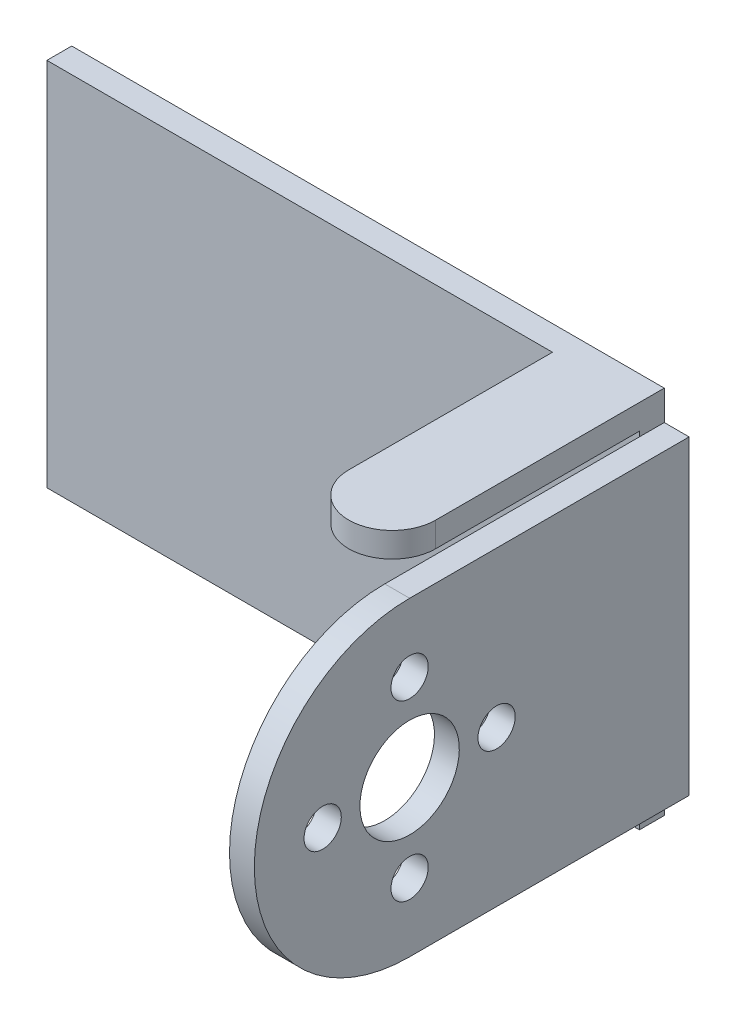
ISO-10303-21;
HEADER;
FILE_DESCRIPTION(('STEP AP214'),'2;1');
FILE_NAME('part.step','',(''),(''),'','','');
FILE_SCHEMA(('AUTOMOTIVE_DESIGN { 1 0 10303 214 1 1 1 1 }'));
ENDSEC;
DATA;
#1=APPLICATION_CONTEXT('core data for automotive mechanical design processes');
#2=APPLICATION_PROTOCOL_DEFINITION('international standard','automotive_design',2000,#1);
#3=PRODUCT_CONTEXT('',#1,'mechanical');
#4=PRODUCT('Part','Part','',(#3));
#5=PRODUCT_RELATED_PRODUCT_CATEGORY('part','',(#4));
#6=PRODUCT_DEFINITION_FORMATION('','',#4);
#7=PRODUCT_DEFINITION_CONTEXT('part definition',#1,'design');
#8=PRODUCT_DEFINITION('design','',#6,#7);
#9=PRODUCT_DEFINITION_SHAPE('','',#8);
#10=(LENGTH_UNIT() NAMED_UNIT(*) SI_UNIT(.MILLI.,.METRE.));
#11=(NAMED_UNIT(*) PLANE_ANGLE_UNIT() SI_UNIT($,.RADIAN.));
#12=(NAMED_UNIT(*) SI_UNIT($,.STERADIAN.) SOLID_ANGLE_UNIT());
#13=UNCERTAINTY_MEASURE_WITH_UNIT(LENGTH_MEASURE(1.E-05),#10,'distance_accuracy_value','');
#14=(GEOMETRIC_REPRESENTATION_CONTEXT(3) GLOBAL_UNCERTAINTY_ASSIGNED_CONTEXT((#13)) GLOBAL_UNIT_ASSIGNED_CONTEXT((#10,
#11,#12)) REPRESENTATION_CONTEXT('',''));
#15=CARTESIAN_POINT('',(0.,0.,0.));
#16=DIRECTION('',(0.,0.,1.));
#17=DIRECTION('',(1.,0.,0.));
#18=AXIS2_PLACEMENT_3D('',#15,#16,#17);
#19=CARTESIAN_POINT('',(23.85,14.9,2.));
#20=DIRECTION('',(-1.,0.,0.));
#21=DIRECTION('',(0.,-1.,0.));
#22=AXIS2_PLACEMENT_3D('',#19,#20,#21);
#23=PLANE('',#22);
#24=DIRECTION('',(0.,0.,1.));
#25=VECTOR('',#24,1.);
#26=CARTESIAN_POINT('',(23.85,12.5,0.));
#27=LINE('',#26,#25);
#28=CARTESIAN_POINT('',(23.85,12.5,0.));
#29=VERTEX_POINT('',#28);
#30=CARTESIAN_POINT('',(23.85,12.5,2.));
#31=VERTEX_POINT('',#30);
#32=EDGE_CURVE('E299',#29,#31,#27,.T.);
#33=ORIENTED_EDGE('',*,*,#32,.F.);
#34=DIRECTION('',(0.,1.,0.));
#35=VECTOR('',#34,1.);
#36=CARTESIAN_POINT('',(23.85,14.9,0.));
#37=LINE('',#36,#35);
#38=CARTESIAN_POINT('',(23.85,14.9,0.));
#39=VERTEX_POINT('',#38);
#40=EDGE_CURVE('E220',#29,#39,#37,.T.);
#41=ORIENTED_EDGE('',*,*,#40,.T.);
#42=DIRECTION('',(0.,0.,-1.));
#43=VECTOR('',#42,1.);
#44=CARTESIAN_POINT('',(23.85,14.9,2.));
#45=LINE('',#44,#43);
#46=CARTESIAN_POINT('',(23.85,14.9,18.4));
#47=VERTEX_POINT('',#46);
#48=EDGE_CURVE('E12',#47,#39,#45,.T.);
#49=ORIENTED_EDGE('',*,*,#48,.F.);
#50=DIRECTION('',(0.,-1.,0.));
#51=VECTOR('',#50,1.);
#52=CARTESIAN_POINT('',(23.85,14.9,18.4));
#53=LINE('',#52,#51);
#54=CARTESIAN_POINT('',(23.85,12.9,18.4));
#55=VERTEX_POINT('',#54);
#56=EDGE_CURVE('E184',#47,#55,#53,.T.);
#57=ORIENTED_EDGE('',*,*,#56,.T.);
#58=DIRECTION('',(0.,0.,-1.));
#59=VECTOR('',#58,1.);
#60=CARTESIAN_POINT('',(23.85,12.9,21.9));
#61=LINE('',#60,#59);
#62=CARTESIAN_POINT('',(23.85,12.9,2.));
#63=VERTEX_POINT('',#62);
#64=EDGE_CURVE('E211',#55,#63,#61,.T.);
#65=ORIENTED_EDGE('',*,*,#64,.T.);
#66=DIRECTION('',(0.,1.,0.));
#67=VECTOR('',#66,1.);
#68=CARTESIAN_POINT('',(23.85,14.9,2.));
#69=LINE('',#68,#67);
#70=EDGE_CURVE('E74',#31,#63,#69,.T.);
#71=ORIENTED_EDGE('',*,*,#70,.F.);
#72=EDGE_LOOP('',(#33,#41,#49,#57,#65,#71));
#73=FACE_BOUND('',#72,.T.);
#74=ADVANCED_FACE('F59',(#73),#23,.F.);
#75=DIRECTION('',(0.,0.,-1.));
#76=VECTOR('',#75,1.);
#77=CARTESIAN_POINT('',(23.85,-12.5,0.));
#78=LINE('',#77,#76);
#79=CARTESIAN_POINT('',(23.85,-12.5,2.));
#80=VERTEX_POINT('',#79);
#81=CARTESIAN_POINT('',(23.85,-12.5,0.));
#82=VERTEX_POINT('',#81);
#83=EDGE_CURVE('E82',#80,#82,#78,.T.);
#84=ORIENTED_EDGE('',*,*,#83,.F.);
#85=CARTESIAN_POINT('',(23.85,-14.9,2.));
#86=VERTEX_POINT('',#85);
#87=EDGE_CURVE('E221',#86,#80,#69,.T.);
#88=ORIENTED_EDGE('',*,*,#87,.F.);
#89=DIRECTION('',(0.,0.,-1.));
#90=VECTOR('',#89,1.);
#91=CARTESIAN_POINT('',(23.85,-14.9,2.));
#92=LINE('',#91,#90);
#93=CARTESIAN_POINT('',(23.85,-14.9,0.));
#94=VERTEX_POINT('',#93);
#95=EDGE_CURVE('E233',#86,#94,#92,.T.);
#96=ORIENTED_EDGE('',*,*,#95,.T.);
#97=EDGE_CURVE('E234',#94,#82,#37,.T.);
#98=ORIENTED_EDGE('',*,*,#97,.T.);
#99=EDGE_LOOP('',(#84,#88,#96,#98));
#100=FACE_BOUND('',#99,.T.);
#101=ADVANCED_FACE('F272',(#100),#23,.F.);
#102=CARTESIAN_POINT('',(-23.85,14.9,2.));
#103=DIRECTION('',(0.,-1.,0.));
#104=DIRECTION('',(0.,0.,-1.));
#105=AXIS2_PLACEMENT_3D('',#102,#103,#104);
#106=PLANE('',#105);
#107=CARTESIAN_POINT('',(20.35,14.9,18.4));
#108=DIRECTION('',(0.,-1.,0.));
#109=DIRECTION('',(0.,0.,-1.));
#110=AXIS2_PLACEMENT_3D('',#107,#108,#109);
#111=CIRCLE('',#110,3.5);
#112=CARTESIAN_POINT('',(16.85,14.9,18.4));
#113=VERTEX_POINT('',#112);
#114=EDGE_CURVE('E194',#47,#113,#111,.T.);
#115=ORIENTED_EDGE('',*,*,#114,.F.);
#116=ORIENTED_EDGE('',*,*,#48,.T.);
#117=DIRECTION('',(-1.,0.,0.));
#118=VECTOR('',#117,1.);
#119=CARTESIAN_POINT('',(-23.85,14.9,0.));
#120=LINE('',#119,#118);
#121=CARTESIAN_POINT('',(-23.85,14.9,0.));
#122=VERTEX_POINT('',#121);
#123=EDGE_CURVE('E237',#39,#122,#120,.T.);
#124=ORIENTED_EDGE('',*,*,#123,.T.);
#125=DIRECTION('',(0.,0.,-1.));
#126=VECTOR('',#125,1.);
#127=CARTESIAN_POINT('',(-23.85,14.9,2.));
#128=LINE('',#127,#126);
#129=CARTESIAN_POINT('',(-23.85,14.9,2.));
#130=VERTEX_POINT('',#129);
#131=EDGE_CURVE('E67',#130,#122,#128,.T.);
#132=ORIENTED_EDGE('',*,*,#131,.F.);
#133=DIRECTION('',(-1.,0.,0.));
#134=VECTOR('',#133,1.);
#135=CARTESIAN_POINT('',(-23.85,14.9,2.));
#136=LINE('',#135,#134);
#137=CARTESIAN_POINT('',(16.85,14.9,2.));
#138=VERTEX_POINT('',#137);
#139=EDGE_CURVE('E224',#138,#130,#136,.T.);
#140=ORIENTED_EDGE('',*,*,#139,.F.);
#141=DIRECTION('',(0.,0.,-1.));
#142=VECTOR('',#141,1.);
#143=CARTESIAN_POINT('',(16.85,14.9,21.9));
#144=LINE('',#143,#142);
#145=EDGE_CURVE('E217',#113,#138,#144,.T.);
#146=ORIENTED_EDGE('',*,*,#145,.F.);
#147=EDGE_LOOP('',(#115,#116,#124,#132,#140,#146));
#148=FACE_BOUND('',#147,.T.);
#149=ADVANCED_FACE('F368',(#148),#106,.F.);
#150=CARTESIAN_POINT('',(16.85,12.9,21.9));
#151=DIRECTION('',(0.,1.,0.));
#152=DIRECTION('',(0.,0.,1.));
#153=AXIS2_PLACEMENT_3D('',#150,#151,#152);
#154=PLANE('',#153);
#155=ORIENTED_EDGE('',*,*,#64,.F.);
#156=CARTESIAN_POINT('',(20.35,12.9,18.4));
#157=DIRECTION('',(0.,-1.,0.));
#158=DIRECTION('',(0.,0.,-1.));
#159=AXIS2_PLACEMENT_3D('',#156,#157,#158);
#160=CIRCLE('',#159,3.5);
#161=CARTESIAN_POINT('',(16.85,12.9,18.4));
#162=VERTEX_POINT('',#161);
#163=EDGE_CURVE('E193',#55,#162,#160,.T.);
#164=ORIENTED_EDGE('',*,*,#163,.T.);
#165=DIRECTION('',(0.,0.,-1.));
#166=VECTOR('',#165,1.);
#167=CARTESIAN_POINT('',(16.85,12.9,21.9));
#168=LINE('',#167,#166);
#169=CARTESIAN_POINT('',(16.85,12.9,2.));
#170=VERTEX_POINT('',#169);
#171=EDGE_CURVE('E214',#162,#170,#168,.T.);
#172=ORIENTED_EDGE('',*,*,#171,.T.);
#173=DIRECTION('',(1.,0.,0.));
#174=VECTOR('',#173,1.);
#175=CARTESIAN_POINT('',(16.85,12.9,2.));
#176=LINE('',#175,#174);
#177=EDGE_CURVE('E207',#170,#63,#176,.T.);
#178=ORIENTED_EDGE('',*,*,#177,.T.);
#179=EDGE_LOOP('',(#155,#164,#172,#178));
#180=FACE_BOUND('',#179,.T.);
#181=ADVANCED_FACE('F376',(#180),#154,.F.);
#182=CARTESIAN_POINT('',(16.85,14.9,21.9));
#183=DIRECTION('',(1.,0.,0.));
#184=DIRECTION('',(0.,0.,-1.));
#185=AXIS2_PLACEMENT_3D('',#182,#183,#184);
#186=PLANE('',#185);
#187=DIRECTION('',(0.,-1.,0.));
#188=VECTOR('',#187,1.);
#189=CARTESIAN_POINT('',(16.85,14.9,18.4));
#190=LINE('',#189,#188);
#191=EDGE_CURVE('E197',#113,#162,#190,.T.);
#192=ORIENTED_EDGE('',*,*,#191,.F.);
#193=ORIENTED_EDGE('',*,*,#145,.T.);
#194=DIRECTION('',(0.,-1.,0.));
#195=VECTOR('',#194,1.);
#196=CARTESIAN_POINT('',(16.85,14.9,2.));
#197=LINE('',#196,#195);
#198=EDGE_CURVE('E203',#138,#170,#197,.T.);
#199=ORIENTED_EDGE('',*,*,#198,.T.);
#200=ORIENTED_EDGE('',*,*,#171,.F.);
#201=EDGE_LOOP('',(#192,#193,#199,#200));
#202=FACE_BOUND('',#201,.T.);
#203=ADVANCED_FACE('F380',(#202),#186,.F.);
#204=CARTESIAN_POINT('',(-23.85,14.9,2.));
#205=DIRECTION('',(1.,0.,0.));
#206=DIRECTION('',(0.,1.,0.));
#207=AXIS2_PLACEMENT_3D('',#204,#205,#206);
#208=PLANE('',#207);
#209=DIRECTION('',(0.,-1.,0.));
#210=VECTOR('',#209,1.);
#211=CARTESIAN_POINT('',(-23.85,14.9,0.));
#212=LINE('',#211,#210);
#213=CARTESIAN_POINT('',(-23.85,-14.9,0.));
#214=VERTEX_POINT('',#213);
#215=EDGE_CURVE('E240',#122,#214,#212,.T.);
#216=ORIENTED_EDGE('',*,*,#215,.T.);
#217=DIRECTION('',(0.,0.,-1.));
#218=VECTOR('',#217,1.);
#219=CARTESIAN_POINT('',(-23.85,-14.9,2.));
#220=LINE('',#219,#218);
#221=CARTESIAN_POINT('',(-23.85,-14.9,2.));
#222=VERTEX_POINT('',#221);
#223=EDGE_CURVE('E249',#222,#214,#220,.T.);
#224=ORIENTED_EDGE('',*,*,#223,.F.);
#225=DIRECTION('',(0.,-1.,0.));
#226=VECTOR('',#225,1.);
#227=CARTESIAN_POINT('',(-23.85,14.9,2.));
#228=LINE('',#227,#226);
#229=EDGE_CURVE('E227',#130,#222,#228,.T.);
#230=ORIENTED_EDGE('',*,*,#229,.F.);
#231=ORIENTED_EDGE('',*,*,#131,.T.);
#232=EDGE_LOOP('',(#216,#224,#230,#231));
#233=FACE_BOUND('',#232,.T.);
#234=ADVANCED_FACE('F258',(#233),#208,.F.);
#235=CARTESIAN_POINT('',(-23.85,-14.9,2.));
#236=DIRECTION('',(0.,1.,0.));
#237=DIRECTION('',(0.,0.,1.));
#238=AXIS2_PLACEMENT_3D('',#235,#236,#237);
#239=PLANE('',#238);
#240=DIRECTION('',(1.,0.,0.));
#241=VECTOR('',#240,1.);
#242=CARTESIAN_POINT('',(-23.85,-14.9,0.));
#243=LINE('',#242,#241);
#244=EDGE_CURVE('E243',#214,#94,#243,.T.);
#245=ORIENTED_EDGE('',*,*,#244,.T.);
#246=ORIENTED_EDGE('',*,*,#95,.F.);
#247=DIRECTION('',(1.,0.,0.));
#248=VECTOR('',#247,1.);
#249=CARTESIAN_POINT('',(-23.85,-14.9,2.));
#250=LINE('',#249,#248);
#251=EDGE_CURVE('E230',#222,#86,#250,.T.);
#252=ORIENTED_EDGE('',*,*,#251,.F.);
#253=ORIENTED_EDGE('',*,*,#223,.T.);
#254=EDGE_LOOP('',(#245,#246,#252,#253));
#255=FACE_BOUND('',#254,.T.);
#256=ADVANCED_FACE('F270',(#255),#239,.F.);
#257=CARTESIAN_POINT('',(0.,0.,2.));
#258=DIRECTION('',(0.,0.,1.));
#259=DIRECTION('',(1.,0.,0.));
#260=AXIS2_PLACEMENT_3D('',#257,#258,#259);
#261=PLANE('',#260);
#262=ORIENTED_EDGE('',*,*,#177,.F.);
#263=ORIENTED_EDGE('',*,*,#198,.F.);
#264=ORIENTED_EDGE('',*,*,#139,.T.);
#265=ORIENTED_EDGE('',*,*,#229,.T.);
#266=ORIENTED_EDGE('',*,*,#251,.T.);
#267=ORIENTED_EDGE('',*,*,#87,.T.);
#268=DIRECTION('',(0.,1.,0.));
#269=VECTOR('',#268,1.);
#270=CARTESIAN_POINT('',(23.85,0.,2.));
#271=LINE('',#270,#269);
#272=EDGE_CURVE('E180',#80,#31,#271,.T.);
#273=ORIENTED_EDGE('',*,*,#272,.T.);
#274=ORIENTED_EDGE('',*,*,#70,.T.);
#275=EDGE_LOOP('',(#262,#263,#264,#265,#266,#267,#273,#274));
#276=FACE_BOUND('',#275,.T.);
#277=ADVANCED_FACE('F276',(#276),#261,.T.);
#278=CARTESIAN_POINT('',(0.,0.,0.));
#279=DIRECTION('',(0.,0.,1.));
#280=DIRECTION('',(1.,0.,0.));
#281=AXIS2_PLACEMENT_3D('',#278,#279,#280);
#282=PLANE('',#281);
#283=DIRECTION('',(-1.,0.,0.));
#284=VECTOR('',#283,1.);
#285=CARTESIAN_POINT('',(25.85,-12.5,0.));
#286=LINE('',#285,#284);
#287=CARTESIAN_POINT('',(25.85,-12.5,0.));
#288=VERTEX_POINT('',#287);
#289=EDGE_CURVE('E186',#288,#82,#286,.T.);
#290=ORIENTED_EDGE('',*,*,#289,.T.);
#291=ORIENTED_EDGE('',*,*,#97,.F.);
#292=ORIENTED_EDGE('',*,*,#244,.F.);
#293=ORIENTED_EDGE('',*,*,#215,.F.);
#294=ORIENTED_EDGE('',*,*,#123,.F.);
#295=ORIENTED_EDGE('',*,*,#40,.F.);
#296=DIRECTION('',(-1.,0.,0.));
#297=VECTOR('',#296,1.);
#298=CARTESIAN_POINT('',(25.85,12.5,0.));
#299=LINE('',#298,#297);
#300=CARTESIAN_POINT('',(25.85,12.5,0.));
#301=VERTEX_POINT('',#300);
#302=EDGE_CURVE('E292',#301,#29,#299,.T.);
#303=ORIENTED_EDGE('',*,*,#302,.F.);
#304=DIRECTION('',(0.,1.,0.));
#305=VECTOR('',#304,1.);
#306=CARTESIAN_POINT('',(25.85,12.5,0.));
#307=LINE('',#306,#305);
#308=EDGE_CURVE('E167',#288,#301,#307,.T.);
#309=ORIENTED_EDGE('',*,*,#308,.F.);
#310=EDGE_LOOP('',(#290,#291,#292,#293,#294,#295,#303,#309));
#311=FACE_BOUND('',#310,.T.);
#312=ADVANCED_FACE('F266',(#311),#282,.F.);
#313=CARTESIAN_POINT('',(20.35,14.9,18.4));
#314=DIRECTION('',(0.,-1.,0.));
#315=DIRECTION('',(0.,0.,-1.));
#316=AXIS2_PLACEMENT_3D('',#313,#314,#315);
#317=CYLINDRICAL_SURFACE('',#316,3.5);
#318=ORIENTED_EDGE('',*,*,#163,.F.);
#319=ORIENTED_EDGE('',*,*,#56,.F.);
#320=ORIENTED_EDGE('',*,*,#114,.T.);
#321=ORIENTED_EDGE('',*,*,#191,.T.);
#322=EDGE_LOOP('',(#318,#319,#320,#321));
#323=FACE_BOUND('',#322,.T.);
#324=ADVANCED_FACE('F351',(#323),#317,.T.);
#325=CARTESIAN_POINT('',(25.85,0.,22.5));
#326=DIRECTION('',(1.,0.,0.));
#327=DIRECTION('',(0.,1.,0.));
#328=AXIS2_PLACEMENT_3D('',#325,#326,#327);
#329=PLANE('',#328);
#330=CARTESIAN_POINT('',(25.85,1.36849894910094E-13,15.5));
#331=DIRECTION('',(1.,0.,0.));
#332=DIRECTION('',(0.,1.,0.));
#333=AXIS2_PLACEMENT_3D('',#330,#331,#332);
#334=CIRCLE('',#333,1.5);
#335=CARTESIAN_POINT('',(25.85,1.50000000000014,15.5));
#336=VERTEX_POINT('',#335);
#337=EDGE_CURVE('E327',#336,#336,#334,.T.);
#338=ORIENTED_EDGE('',*,*,#337,.F.);
#339=EDGE_LOOP('',(#338));
#340=FACE_BOUND('',#339,.T.);
#341=CARTESIAN_POINT('',(25.85,0.,29.5));
#342=DIRECTION('',(1.,0.,0.));
#343=DIRECTION('',(0.,1.,0.));
#344=AXIS2_PLACEMENT_3D('',#341,#342,#343);
#345=CIRCLE('',#344,1.5);
#346=CARTESIAN_POINT('',(25.85,1.5,29.5));
#347=VERTEX_POINT('',#346);
#348=EDGE_CURVE('E312',#347,#347,#345,.T.);
#349=ORIENTED_EDGE('',*,*,#348,.F.);
#350=EDGE_LOOP('',(#349));
#351=FACE_BOUND('',#350,.T.);
#352=DIRECTION('',(0.,0.,1.));
#353=VECTOR('',#352,1.);
#354=CARTESIAN_POINT('',(25.85,12.5,0.));
#355=LINE('',#354,#353);
#356=CARTESIAN_POINT('',(25.85,12.5,22.5));
#357=VERTEX_POINT('',#356);
#358=EDGE_CURVE('E161',#301,#357,#355,.T.);
#359=ORIENTED_EDGE('',*,*,#358,.T.);
#360=CARTESIAN_POINT('',(25.85,0.,22.5));
#361=DIRECTION('',(1.,0.,0.));
#362=DIRECTION('',(0.,1.,0.));
#363=AXIS2_PLACEMENT_3D('',#360,#361,#362);
#364=CIRCLE('',#363,12.5);
#365=CARTESIAN_POINT('',(25.85,-12.5,22.5));
#366=VERTEX_POINT('',#365);
#367=EDGE_CURVE('E150',#357,#366,#364,.T.);
#368=ORIENTED_EDGE('',*,*,#367,.T.);
#369=DIRECTION('',(0.,0.,-1.));
#370=VECTOR('',#369,1.);
#371=CARTESIAN_POINT('',(25.85,-12.5,0.));
#372=LINE('',#371,#370);
#373=EDGE_CURVE('E160',#366,#288,#372,.T.);
#374=ORIENTED_EDGE('',*,*,#373,.T.);
#375=ORIENTED_EDGE('',*,*,#308,.T.);
#376=EDGE_LOOP('',(#359,#368,#374,#375));
#377=FACE_BOUND('',#376,.T.);
#378=CARTESIAN_POINT('',(25.85,0.,22.5));
#379=DIRECTION('',(1.,0.,0.));
#380=DIRECTION('',(0.,1.,0.));
#381=AXIS2_PLACEMENT_3D('',#378,#379,#380);
#382=CIRCLE('',#381,4.);
#383=CARTESIAN_POINT('',(25.85,4.,22.5));
#384=VERTEX_POINT('',#383);
#385=EDGE_CURVE('E303',#384,#384,#382,.T.);
#386=ORIENTED_EDGE('',*,*,#385,.F.);
#387=EDGE_LOOP('',(#386));
#388=FACE_BOUND('',#387,.T.);
#389=CARTESIAN_POINT('',(25.85,7.00000000000009,22.5000000000001));
#390=DIRECTION('',(1.,0.,0.));
#391=DIRECTION('',(0.,1.,0.));
#392=AXIS2_PLACEMENT_3D('',#389,#390,#391);
#393=CIRCLE('',#392,1.5);
#394=CARTESIAN_POINT('',(25.85,8.50000000000009,22.5000000000001));
#395=VERTEX_POINT('',#394);
#396=EDGE_CURVE('E319',#395,#395,#393,.T.);
#397=ORIENTED_EDGE('',*,*,#396,.F.);
#398=EDGE_LOOP('',(#397));
#399=FACE_BOUND('',#398,.T.);
#400=CARTESIAN_POINT('',(25.85,-6.99999999999991,22.5));
#401=DIRECTION('',(1.,0.,0.));
#402=DIRECTION('',(0.,1.,0.));
#403=AXIS2_PLACEMENT_3D('',#400,#401,#402);
#404=CIRCLE('',#403,1.5);
#405=CARTESIAN_POINT('',(25.85,-5.49999999999991,22.5));
#406=VERTEX_POINT('',#405);
#407=EDGE_CURVE('E335',#406,#406,#404,.T.);
#408=ORIENTED_EDGE('',*,*,#407,.F.);
#409=EDGE_LOOP('',(#408));
#410=FACE_BOUND('',#409,.T.);
#411=ADVANCED_FACE('F164',(#340,#351,#377,#388,#399,#410),#329,.T.);
#412=CARTESIAN_POINT('',(23.85,0.,22.5));
#413=DIRECTION('',(1.,0.,0.));
#414=DIRECTION('',(0.,1.,0.));
#415=AXIS2_PLACEMENT_3D('',#412,#413,#414);
#416=PLANE('',#415);
#417=ORIENTED_EDGE('',*,*,#272,.F.);
#418=CARTESIAN_POINT('',(23.85,-12.5,22.5));
#419=VERTEX_POINT('',#418);
#420=EDGE_CURVE('E172',#419,#80,#78,.T.);
#421=ORIENTED_EDGE('',*,*,#420,.F.);
#422=CARTESIAN_POINT('',(23.85,0.,22.5));
#423=DIRECTION('',(1.,0.,0.));
#424=DIRECTION('',(0.,1.,0.));
#425=AXIS2_PLACEMENT_3D('',#422,#423,#424);
#426=CIRCLE('',#425,12.5);
#427=CARTESIAN_POINT('',(23.85,12.5,22.5));
#428=VERTEX_POINT('',#427);
#429=EDGE_CURVE('E288',#428,#419,#426,.T.);
#430=ORIENTED_EDGE('',*,*,#429,.F.);
#431=EDGE_CURVE('E177',#31,#428,#27,.T.);
#432=ORIENTED_EDGE('',*,*,#431,.F.);
#433=EDGE_LOOP('',(#417,#421,#430,#432));
#434=FACE_BOUND('',#433,.T.);
#435=CARTESIAN_POINT('',(23.85,0.,22.5));
#436=DIRECTION('',(1.,0.,0.));
#437=DIRECTION('',(0.,1.,0.));
#438=AXIS2_PLACEMENT_3D('',#435,#436,#437);
#439=CIRCLE('',#438,4.);
#440=CARTESIAN_POINT('',(23.85,4.,22.5));
#441=VERTEX_POINT('',#440);
#442=EDGE_CURVE('E306',#441,#441,#439,.T.);
#443=ORIENTED_EDGE('',*,*,#442,.T.);
#444=EDGE_LOOP('',(#443));
#445=FACE_BOUND('',#444,.T.);
#446=CARTESIAN_POINT('',(23.85,0.,29.5));
#447=DIRECTION('',(1.,0.,0.));
#448=DIRECTION('',(0.,1.,0.));
#449=AXIS2_PLACEMENT_3D('',#446,#447,#448);
#450=CIRCLE('',#449,1.5);
#451=CARTESIAN_POINT('',(23.85,1.5,29.5));
#452=VERTEX_POINT('',#451);
#453=EDGE_CURVE('E315',#452,#452,#450,.T.);
#454=ORIENTED_EDGE('',*,*,#453,.T.);
#455=EDGE_LOOP('',(#454));
#456=FACE_BOUND('',#455,.T.);
#457=CARTESIAN_POINT('',(23.85,7.00000000000009,22.5000000000001));
#458=DIRECTION('',(1.,0.,0.));
#459=DIRECTION('',(0.,1.,0.));
#460=AXIS2_PLACEMENT_3D('',#457,#458,#459);
#461=CIRCLE('',#460,1.5);
#462=CARTESIAN_POINT('',(23.85,8.50000000000009,22.5000000000001));
#463=VERTEX_POINT('',#462);
#464=EDGE_CURVE('E323',#463,#463,#461,.T.);
#465=ORIENTED_EDGE('',*,*,#464,.T.);
#466=EDGE_LOOP('',(#465));
#467=FACE_BOUND('',#466,.T.);
#468=CARTESIAN_POINT('',(23.85,1.36617046121372E-13,15.5));
#469=DIRECTION('',(1.,0.,0.));
#470=DIRECTION('',(0.,1.,0.));
#471=AXIS2_PLACEMENT_3D('',#468,#469,#470);
#472=CIRCLE('',#471,1.5);
#473=CARTESIAN_POINT('',(23.85,1.50000000000014,15.5));
#474=VERTEX_POINT('',#473);
#475=EDGE_CURVE('E331',#474,#474,#472,.T.);
#476=ORIENTED_EDGE('',*,*,#475,.T.);
#477=EDGE_LOOP('',(#476));
#478=FACE_BOUND('',#477,.T.);
#479=CARTESIAN_POINT('',(23.85,-6.99999999999991,22.5));
#480=DIRECTION('',(1.,0.,0.));
#481=DIRECTION('',(0.,1.,0.));
#482=AXIS2_PLACEMENT_3D('',#479,#480,#481);
#483=CIRCLE('',#482,1.5);
#484=CARTESIAN_POINT('',(23.85,-5.49999999999991,22.5));
#485=VERTEX_POINT('',#484);
#486=EDGE_CURVE('E339',#485,#485,#483,.T.);
#487=ORIENTED_EDGE('',*,*,#486,.T.);
#488=EDGE_LOOP('',(#487));
#489=FACE_BOUND('',#488,.T.);
#490=ADVANCED_FACE('F280',(#434,#445,#456,#467,#478,#489),#416,.F.);
#491=CARTESIAN_POINT('',(25.85,12.5,0.));
#492=DIRECTION('',(0.,-1.,0.));
#493=DIRECTION('',(0.,0.,-1.));
#494=AXIS2_PLACEMENT_3D('',#491,#492,#493);
#495=PLANE('',#494);
#496=ORIENTED_EDGE('',*,*,#32,.T.);
#497=ORIENTED_EDGE('',*,*,#431,.T.);
#498=DIRECTION('',(-1.,0.,0.));
#499=VECTOR('',#498,1.);
#500=CARTESIAN_POINT('',(25.85,12.5,22.5));
#501=LINE('',#500,#499);
#502=EDGE_CURVE('E154',#357,#428,#501,.T.);
#503=ORIENTED_EDGE('',*,*,#502,.F.);
#504=ORIENTED_EDGE('',*,*,#358,.F.);
#505=ORIENTED_EDGE('',*,*,#302,.T.);
#506=EDGE_LOOP('',(#496,#497,#503,#504,#505));
#507=FACE_BOUND('',#506,.T.);
#508=ADVANCED_FACE('F175',(#507),#495,.F.);
#509=CARTESIAN_POINT('',(25.85,0.,22.5));
#510=DIRECTION('',(-1.,0.,0.));
#511=DIRECTION('',(0.,-1.,0.));
#512=AXIS2_PLACEMENT_3D('',#509,#510,#511);
#513=CYLINDRICAL_SURFACE('',#512,12.5);
#514=ORIENTED_EDGE('',*,*,#429,.T.);
#515=DIRECTION('',(-1.,0.,0.));
#516=VECTOR('',#515,1.);
#517=CARTESIAN_POINT('',(25.85,-12.5,22.5));
#518=LINE('',#517,#516);
#519=EDGE_CURVE('E156',#366,#419,#518,.T.);
#520=ORIENTED_EDGE('',*,*,#519,.F.);
#521=ORIENTED_EDGE('',*,*,#367,.F.);
#522=ORIENTED_EDGE('',*,*,#502,.T.);
#523=EDGE_LOOP('',(#514,#520,#521,#522));
#524=FACE_BOUND('',#523,.T.);
#525=ADVANCED_FACE('F152',(#524),#513,.T.);
#526=CARTESIAN_POINT('',(25.85,-12.5,0.));
#527=DIRECTION('',(0.,1.,0.));
#528=DIRECTION('',(0.,0.,1.));
#529=AXIS2_PLACEMENT_3D('',#526,#527,#528);
#530=PLANE('',#529);
#531=ORIENTED_EDGE('',*,*,#420,.T.);
#532=ORIENTED_EDGE('',*,*,#83,.T.);
#533=ORIENTED_EDGE('',*,*,#289,.F.);
#534=ORIENTED_EDGE('',*,*,#373,.F.);
#535=ORIENTED_EDGE('',*,*,#519,.T.);
#536=EDGE_LOOP('',(#531,#532,#533,#534,#535));
#537=FACE_BOUND('',#536,.T.);
#538=ADVANCED_FACE('F283',(#537),#530,.F.);
#539=CARTESIAN_POINT('',(25.85,0.,22.5));
#540=DIRECTION('',(-1.,0.,0.));
#541=DIRECTION('',(0.,-1.,0.));
#542=AXIS2_PLACEMENT_3D('',#539,#540,#541);
#543=CYLINDRICAL_SURFACE('',#542,4.);
#544=ORIENTED_EDGE('',*,*,#385,.T.);
#545=EDGE_LOOP('',(#544));
#546=FACE_BOUND('',#545,.T.);
#547=ORIENTED_EDGE('',*,*,#442,.F.);
#548=EDGE_LOOP('',(#547));
#549=FACE_BOUND('',#548,.T.);
#550=ADVANCED_FACE('F403',(#546,#549),#543,.F.);
#551=CARTESIAN_POINT('',(25.85,0.,29.5));
#552=DIRECTION('',(-1.,0.,0.));
#553=DIRECTION('',(0.,-1.,0.));
#554=AXIS2_PLACEMENT_3D('',#551,#552,#553);
#555=CYLINDRICAL_SURFACE('',#554,1.5);
#556=ORIENTED_EDGE('',*,*,#348,.T.);
#557=EDGE_LOOP('',(#556));
#558=FACE_BOUND('',#557,.T.);
#559=ORIENTED_EDGE('',*,*,#453,.F.);
#560=EDGE_LOOP('',(#559));
#561=FACE_BOUND('',#560,.T.);
#562=ADVANCED_FACE('F407',(#558,#561),#555,.F.);
#563=CARTESIAN_POINT('',(25.85,7.00000000000009,22.5000000000001));
#564=DIRECTION('',(-1.,0.,0.));
#565=DIRECTION('',(0.,-1.,0.));
#566=AXIS2_PLACEMENT_3D('',#563,#564,#565);
#567=CYLINDRICAL_SURFACE('',#566,1.5);
#568=ORIENTED_EDGE('',*,*,#396,.T.);
#569=EDGE_LOOP('',(#568));
#570=FACE_BOUND('',#569,.T.);
#571=ORIENTED_EDGE('',*,*,#464,.F.);
#572=EDGE_LOOP('',(#571));
#573=FACE_BOUND('',#572,.T.);
#574=ADVANCED_FACE('F411',(#570,#573),#567,.F.);
#575=CARTESIAN_POINT('',(25.85,1.36849894910094E-13,15.5));
#576=DIRECTION('',(-1.,0.,0.));
#577=DIRECTION('',(0.,-1.,0.));
#578=AXIS2_PLACEMENT_3D('',#575,#576,#577);
#579=CYLINDRICAL_SURFACE('',#578,1.5);
#580=ORIENTED_EDGE('',*,*,#337,.T.);
#581=EDGE_LOOP('',(#580));
#582=FACE_BOUND('',#581,.T.);
#583=ORIENTED_EDGE('',*,*,#475,.F.);
#584=EDGE_LOOP('',(#583));
#585=FACE_BOUND('',#584,.T.);
#586=ADVANCED_FACE('F418',(#582,#585),#579,.F.);
#587=CARTESIAN_POINT('',(25.85,-6.99999999999991,22.5));
#588=DIRECTION('',(-1.,0.,0.));
#589=DIRECTION('',(0.,-1.,0.));
#590=AXIS2_PLACEMENT_3D('',#587,#588,#589);
#591=CYLINDRICAL_SURFACE('',#590,1.5);
#592=ORIENTED_EDGE('',*,*,#407,.T.);
#593=EDGE_LOOP('',(#592));
#594=FACE_BOUND('',#593,.T.);
#595=ORIENTED_EDGE('',*,*,#486,.F.);
#596=EDGE_LOOP('',(#595));
#597=FACE_BOUND('',#596,.T.);
#598=ADVANCED_FACE('F347',(#594,#597),#591,.F.);
#599=CLOSED_SHELL('',(#74,#101,#149,#181,#203,#234,#256,#277,#312,#324,#411,#490,#508,#525,#538,
#550,#562,#574,#586,#598));
#600=MANIFOLD_SOLID_BREP('B2',#599);
#601=ADVANCED_BREP_SHAPE_REPRESENTATION('',(#18,#600),#14);
#602=SHAPE_DEFINITION_REPRESENTATION(#9,#601);
ENDSEC;
END-ISO-10303-21;
